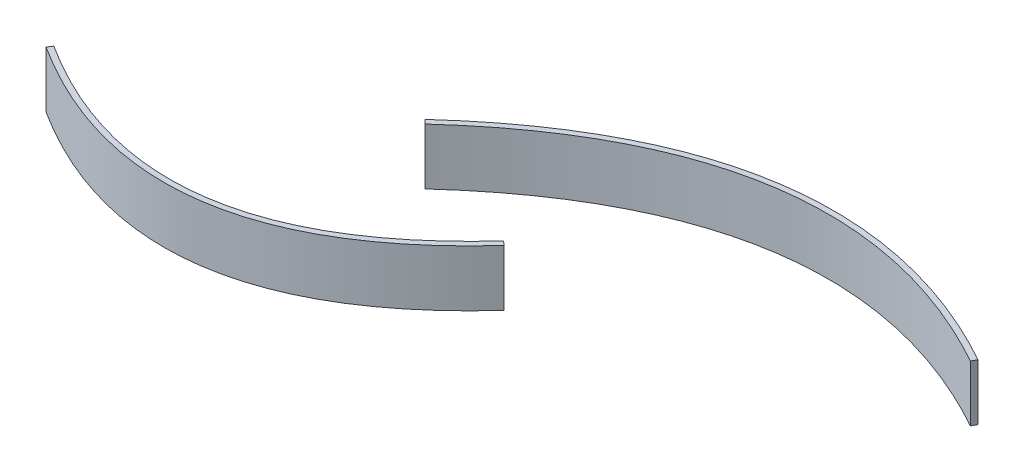
ISO-10303-21;
HEADER;
FILE_DESCRIPTION(('STEP AP214'),'2;1');
FILE_NAME('part.step','',(''),(''),'','','');
FILE_SCHEMA(('AUTOMOTIVE_DESIGN { 1 0 10303 214 1 1 1 1 }'));
ENDSEC;
DATA;
#1=APPLICATION_CONTEXT('core data for automotive mechanical design processes');
#2=APPLICATION_PROTOCOL_DEFINITION('international standard','automotive_design',2000,#1);
#3=PRODUCT_CONTEXT('',#1,'mechanical');
#4=PRODUCT('Part','Part','',(#3));
#5=PRODUCT_RELATED_PRODUCT_CATEGORY('part','',(#4));
#6=PRODUCT_DEFINITION_FORMATION('','',#4);
#7=PRODUCT_DEFINITION_CONTEXT('part definition',#1,'design');
#8=PRODUCT_DEFINITION('design','',#6,#7);
#9=PRODUCT_DEFINITION_SHAPE('','',#8);
#10=(LENGTH_UNIT() NAMED_UNIT(*) SI_UNIT(.MILLI.,.METRE.));
#11=(NAMED_UNIT(*) PLANE_ANGLE_UNIT() SI_UNIT($,.RADIAN.));
#12=(NAMED_UNIT(*) SI_UNIT($,.STERADIAN.) SOLID_ANGLE_UNIT());
#13=UNCERTAINTY_MEASURE_WITH_UNIT(LENGTH_MEASURE(1.E-05),#10,'distance_accuracy_value','');
#14=(GEOMETRIC_REPRESENTATION_CONTEXT(3) GLOBAL_UNCERTAINTY_ASSIGNED_CONTEXT((#13)) GLOBAL_UNIT_ASSIGNED_CONTEXT((#10,
#11,#12)) REPRESENTATION_CONTEXT('',''));
#15=CARTESIAN_POINT('',(0.,0.,0.));
#16=DIRECTION('',(0.,0.,1.));
#17=DIRECTION('',(1.,0.,0.));
#18=AXIS2_PLACEMENT_3D('',#15,#16,#17);
#19=CARTESIAN_POINT('',(374.628296099274,100.,-501.565262469826));
#20=DIRECTION('',(-0.843473753017367,0.,-0.537170390072645));
#21=DIRECTION('',(-0.537170390072645,0.,0.843473753017367));
#22=AXIS2_PLACEMENT_3D('',#19,#20,#21);
#23=PLANE('',#22);
#24=DIRECTION('',(0.537170390072645,0.,-0.843473753017367));
#25=VECTOR('',#24,1.);
#26=CARTESIAN_POINT('',(374.628296099274,0.,-501.565262469826));
#27=LINE('',#26,#25);
#28=CARTESIAN_POINT('',(374.628296099274,0.,-501.565262469826));
#29=VERTEX_POINT('',#28);
#30=CARTESIAN_POINT('',(380.,0.,-510.));
#31=VERTEX_POINT('',#30);
#32=EDGE_CURVE('E12',#29,#31,#27,.T.);
#33=ORIENTED_EDGE('',*,*,#32,.F.);
#34=DIRECTION('',(0.,-1.,0.));
#35=VECTOR('',#34,1.);
#36=CARTESIAN_POINT('',(374.628296099274,100.,-501.565262469826));
#37=LINE('',#36,#35);
#38=CARTESIAN_POINT('',(374.628296099274,100.,-501.565262469826));
#39=VERTEX_POINT('',#38);
#40=EDGE_CURVE('E89',#39,#29,#37,.T.);
#41=ORIENTED_EDGE('',*,*,#40,.F.);
#42=DIRECTION('',(0.537170390072645,0.,-0.843473753017367));
#43=VECTOR('',#42,1.);
#44=CARTESIAN_POINT('',(374.628296099274,100.,-501.565262469826));
#45=LINE('',#44,#43);
#46=CARTESIAN_POINT('',(380.,100.,-510.));
#47=VERTEX_POINT('',#46);
#48=EDGE_CURVE('E47',#39,#47,#45,.T.);
#49=ORIENTED_EDGE('',*,*,#48,.T.);
#50=DIRECTION('',(0.,-1.,0.));
#51=VECTOR('',#50,1.);
#52=CARTESIAN_POINT('',(380.,100.,-510.));
#53=LINE('',#52,#51);
#54=EDGE_CURVE('E62',#47,#31,#53,.T.);
#55=ORIENTED_EDGE('',*,*,#54,.T.);
#56=EDGE_LOOP('',(#33,#41,#49,#55));
#57=FACE_BOUND('',#56,.T.);
#58=ADVANCED_FACE('F43',(#57),#23,.T.);
#59=CARTESIAN_POINT('',(374.628296099274,100.,-501.565262469826));
#60=CARTESIAN_POINT('',(376.652675636594,100.,-500.276026448163));
#61=CARTESIAN_POINT('',(380.720758417512,100.,-497.707701121464));
#62=CARTESIAN_POINT('',(388.82405260283,100.,-492.681835618001));
#63=CARTESIAN_POINT('',(398.942317337423,100.,-486.574959139185));
#64=CARTESIAN_POINT('',(411.051084523365,100.,-479.537732392362));
#65=CARTESIAN_POINT('',(427.15772434303,100.,-470.539431246888));
#66=CARTESIAN_POINT('',(447.216750525808,100.,-460.014930368174));
#67=CARTESIAN_POINT('',(471.170377073836,100.,-448.544102413651));
#68=CARTESIAN_POINT('',(495.007185990314,100.,-438.233929118475));
#69=CARTESIAN_POINT('',(526.634300021727,100.,-426.037434744881));
#70=CARTESIAN_POINT('',(565.877106852233,100.,-413.704742254454));
#71=CARTESIAN_POINT('',(612.497099342666,100.,-403.587039941088));
#72=CARTESIAN_POINT('',(658.630861524168,100.,-398.171948107563));
#73=CARTESIAN_POINT('',(704.254057326222,100.,-397.476841105064));
#74=CARTESIAN_POINT('',(749.33471932846,100.,-401.511344410625));
#75=CARTESIAN_POINT('',(793.83769955949,100.,-410.274498162204));
#76=CARTESIAN_POINT('',(837.730363715614,100.,-423.754574123776));
#77=CARTESIAN_POINT('',(880.987503579431,100.,-441.931705095733));
#78=CARTESIAN_POINT('',(923.593867320603,100.,-464.782175640625));
#79=CARTESIAN_POINT('',(958.552261081277,100.,-487.699165006463));
#80=CARTESIAN_POINT('',(986.192007844851,100.,-508.347722137583));
#81=CARTESIAN_POINT('',(1006.75917592492,100.,-524.98957830755));
#82=CARTESIAN_POINT('',(1027.16474125962,100.,-542.785115939898));
#83=CARTESIAN_POINT('',(1044.03554306489,100.,-558.574716153539));
#84=CARTESIAN_POINT('',(1057.45285613472,100.,-571.782145534757));
#85=CARTESIAN_POINT('',(1067.4754843417,100.,-581.974522933829));
#86=CARTESIAN_POINT('',(1075.79709217904,100.,-590.71027783402));
#87=CARTESIAN_POINT('',(1082.42955700171,100.,-597.836888742615));
#88=CARTESIAN_POINT('',(1085.74867450723,100.,-601.458442056402));
#89=CARTESIAN_POINT('',(1087.39761253075,100.,-603.271305561629));
#90=B_SPLINE_CURVE_WITH_KNOTS('',3,(#59,#60,#61,#62,#63,#64,#65,#66,#67,#68,#69,#70,#71,#72,#73,
#74,#75,#76,#77,#78,#79,#80,#81,#82,#83,#84,#85,#86,#87,#88,#89),.UNSPECIFIED.,.F.,.F.,(4,1,1,1,
1,1,1,1,1,1,1,1,1,1,1,1,1,1,1,1,1,1,1,1,1,1,1,1,4),(0.,0.0078125,0.015625,0.03125,0.046875,
0.0625,0.09375,0.125,0.15625,0.1875,0.25,0.3125,0.375,0.4375,0.5,0.5625,0.625,0.6875,0.75,
0.8125,0.84375,0.875,0.90625,0.9375,0.953125,0.96875,0.984375,0.9921875,1.),.UNSPECIFIED.);
#91=DIRECTION('',(0.,-1.,0.));
#92=VECTOR('',#91,1.);
#93=SURFACE_OF_LINEAR_EXTRUSION('',#90,#92);
#94=CARTESIAN_POINT('',(374.628296099274,0.,-501.565262469826));
#95=CARTESIAN_POINT('',(376.652675636594,0.,-500.276026448163));
#96=CARTESIAN_POINT('',(380.720758417512,0.,-497.707701121464));
#97=CARTESIAN_POINT('',(388.82405260283,0.,-492.681835618001));
#98=CARTESIAN_POINT('',(398.942317337423,0.,-486.574959139185));
#99=CARTESIAN_POINT('',(411.051084523365,0.,-479.537732392362));
#100=CARTESIAN_POINT('',(427.15772434303,0.,-470.539431246888));
#101=CARTESIAN_POINT('',(447.216750525808,0.,-460.014930368174));
#102=CARTESIAN_POINT('',(471.170377073836,0.,-448.544102413651));
#103=CARTESIAN_POINT('',(495.007185990314,0.,-438.233929118475));
#104=CARTESIAN_POINT('',(526.634300021727,0.,-426.037434744881));
#105=CARTESIAN_POINT('',(565.877106852233,0.,-413.704742254454));
#106=CARTESIAN_POINT('',(612.497099342666,0.,-403.587039941088));
#107=CARTESIAN_POINT('',(658.630861524168,0.,-398.171948107563));
#108=CARTESIAN_POINT('',(704.254057326222,0.,-397.476841105064));
#109=CARTESIAN_POINT('',(749.33471932846,0.,-401.511344410625));
#110=CARTESIAN_POINT('',(793.83769955949,0.,-410.274498162204));
#111=CARTESIAN_POINT('',(837.730363715614,0.,-423.754574123776));
#112=CARTESIAN_POINT('',(880.987503579431,0.,-441.931705095733));
#113=CARTESIAN_POINT('',(923.593867320603,0.,-464.782175640625));
#114=CARTESIAN_POINT('',(958.552261081277,0.,-487.699165006463));
#115=CARTESIAN_POINT('',(986.192007844851,0.,-508.347722137583));
#116=CARTESIAN_POINT('',(1006.75917592492,0.,-524.98957830755));
#117=CARTESIAN_POINT('',(1027.16474125962,0.,-542.785115939898));
#118=CARTESIAN_POINT('',(1044.03554306489,0.,-558.574716153539));
#119=CARTESIAN_POINT('',(1057.45285613472,0.,-571.782145534757));
#120=CARTESIAN_POINT('',(1067.4754843417,0.,-581.974522933829));
#121=CARTESIAN_POINT('',(1075.79709217904,0.,-590.71027783402));
#122=CARTESIAN_POINT('',(1082.42955700171,0.,-597.836888742615));
#123=CARTESIAN_POINT('',(1085.74867450723,0.,-601.458442056402));
#124=CARTESIAN_POINT('',(1087.39761253075,0.,-603.271305561629));
#125=B_SPLINE_CURVE_WITH_KNOTS('',3,(#94,#95,#96,#97,#98,#99,#100,#101,#102,#103,#104,#105,#106,
#107,#108,#109,#110,#111,#112,#113,#114,#115,#116,#117,#118,#119,#120,#121,#122,#123,#124),
.UNSPECIFIED.,.F.,.F.,(4,1,1,1,1,1,1,1,1,1,1,1,1,1,1,1,1,1,1,1,1,1,1,1,1,1,1,1,4),(0.,0.0078125,
0.015625,0.03125,0.046875,0.0625,0.09375,0.125,0.15625,0.1875,0.25,0.3125,0.375,0.4375,0.5,
0.5625,0.625,0.6875,0.75,0.8125,0.84375,0.875,0.90625,0.9375,0.953125,0.96875,0.984375,
0.9921875,1.),.UNSPECIFIED.);
#126=CARTESIAN_POINT('',(1087.39761253075,0.,-603.271305561629));
#127=VERTEX_POINT('',#126);
#128=EDGE_CURVE('E92',#29,#127,#125,.T.);
#129=ORIENTED_EDGE('',*,*,#128,.T.);
#130=DIRECTION('',(0.,-1.,0.));
#131=VECTOR('',#130,1.);
#132=CARTESIAN_POINT('',(1087.39761253075,100.,-603.271305561629));
#133=LINE('',#132,#131);
#134=CARTESIAN_POINT('',(1087.39761253075,100.,-603.271305561629));
#135=VERTEX_POINT('',#134);
#136=EDGE_CURVE('E95',#135,#127,#133,.T.);
#137=ORIENTED_EDGE('',*,*,#136,.F.);
#138=EDGE_CURVE('E118',#39,#135,#90,.T.);
#139=ORIENTED_EDGE('',*,*,#138,.F.);
#140=ORIENTED_EDGE('',*,*,#40,.T.);
#141=EDGE_LOOP('',(#129,#137,#139,#140));
#142=FACE_BOUND('',#141,.T.);
#143=ADVANCED_FACE('F94',(#142),#93,.F.);
#144=CARTESIAN_POINT('',(1087.39761253075,100.,-603.271305561629));
#145=DIRECTION('',(-0.672869443837063,0.,0.739761253074532));
#146=DIRECTION('',(0.739761253074532,0.,0.672869443837063));
#147=AXIS2_PLACEMENT_3D('',#144,#145,#146);
#148=PLANE('',#147);
#149=DIRECTION('',(-0.739761253074532,0.,-0.672869443837063));
#150=VECTOR('',#149,1.);
#151=CARTESIAN_POINT('',(1087.39761253075,0.,-603.271305561629));
#152=LINE('',#151,#150);
#153=CARTESIAN_POINT('',(1080.,0.,-610.));
#154=VERTEX_POINT('',#153);
#155=EDGE_CURVE('E98',#127,#154,#152,.T.);
#156=ORIENTED_EDGE('',*,*,#155,.T.);
#157=DIRECTION('',(0.,-1.,0.));
#158=VECTOR('',#157,1.);
#159=CARTESIAN_POINT('',(1080.,100.,-610.));
#160=LINE('',#159,#158);
#161=CARTESIAN_POINT('',(1080.,100.,-610.));
#162=VERTEX_POINT('',#161);
#163=EDGE_CURVE('E104',#162,#154,#160,.T.);
#164=ORIENTED_EDGE('',*,*,#163,.F.);
#165=DIRECTION('',(-0.739761253074532,0.,-0.672869443837063));
#166=VECTOR('',#165,1.);
#167=CARTESIAN_POINT('',(1087.39761253075,100.,-603.271305561629));
#168=LINE('',#167,#166);
#169=EDGE_CURVE('E79',#135,#162,#168,.T.);
#170=ORIENTED_EDGE('',*,*,#169,.F.);
#171=ORIENTED_EDGE('',*,*,#136,.T.);
#172=EDGE_LOOP('',(#156,#164,#170,#171));
#173=FACE_BOUND('',#172,.T.);
#174=ADVANCED_FACE('F102',(#173),#148,.F.);
#175=CARTESIAN_POINT('',(380.,100.,-510.));
#176=CARTESIAN_POINT('',(765.648450941771,100.,-264.397895509813));
#177=CARTESIAN_POINT('',(1080.,100.,-610.));
#178=B_SPLINE_CURVE_WITH_KNOTS('',2,(#175,#176,#177),.UNSPECIFIED.,.F.,.F.,(3,3),(0.,1.),.UNSPECIFIED.);
#179=DIRECTION('',(0.,-1.,0.));
#180=VECTOR('',#179,1.);
#181=SURFACE_OF_LINEAR_EXTRUSION('',#178,#180);
#182=CARTESIAN_POINT('',(380.,0.,-510.));
#183=CARTESIAN_POINT('',(765.648450941771,0.,-264.397895509813));
#184=CARTESIAN_POINT('',(1080.,0.,-610.));
#185=B_SPLINE_CURVE_WITH_KNOTS('',2,(#182,#183,#184),.UNSPECIFIED.,.F.,.F.,(3,3),(0.,1.),.UNSPECIFIED.);
#186=EDGE_CURVE('E53',#31,#154,#185,.T.);
#187=ORIENTED_EDGE('',*,*,#186,.F.);
#188=ORIENTED_EDGE('',*,*,#54,.F.);
#189=EDGE_CURVE('E140',#47,#162,#178,.T.);
#190=ORIENTED_EDGE('',*,*,#189,.T.);
#191=ORIENTED_EDGE('',*,*,#163,.T.);
#192=EDGE_LOOP('',(#187,#188,#190,#191));
#193=FACE_BOUND('',#192,.T.);
#194=ADVANCED_FACE('F134',(#193),#181,.T.);
#195=CARTESIAN_POINT('',(747.824225470885,100.,-412.198947754906));
#196=DIRECTION('',(0.,-1.,0.));
#197=DIRECTION('',(0.,0.,-1.));
#198=AXIS2_PLACEMENT_3D('',#195,#196,#197);
#199=PLANE('',#198);
#200=ORIENTED_EDGE('',*,*,#48,.F.);
#201=ORIENTED_EDGE('',*,*,#138,.T.);
#202=ORIENTED_EDGE('',*,*,#169,.T.);
#203=ORIENTED_EDGE('',*,*,#189,.F.);
#204=EDGE_LOOP('',(#200,#201,#202,#203));
#205=FACE_BOUND('',#204,.T.);
#206=ADVANCED_FACE('F45',(#205),#199,.F.);
#207=CARTESIAN_POINT('',(747.824225470885,0.,-412.198947754906));
#208=DIRECTION('',(0.,-1.,0.));
#209=DIRECTION('',(0.,0.,-1.));
#210=AXIS2_PLACEMENT_3D('',#207,#208,#209);
#211=PLANE('',#210);
#212=ORIENTED_EDGE('',*,*,#32,.T.);
#213=ORIENTED_EDGE('',*,*,#186,.T.);
#214=ORIENTED_EDGE('',*,*,#155,.F.);
#215=ORIENTED_EDGE('',*,*,#128,.F.);
#216=EDGE_LOOP('',(#212,#213,#214,#215));
#217=FACE_BOUND('',#216,.T.);
#218=ADVANCED_FACE('F106',(#217),#211,.T.);
#219=CLOSED_SHELL('',(#58,#143,#174,#194,#206,#218));
#220=MANIFOLD_SOLID_BREP('B2',#219);
#221=CARTESIAN_POINT('',(830.,100.,-720.));
#222=DIRECTION('',(-0.73894708734198,0.,0.673763461541811));
#223=DIRECTION('',(0.673763461541811,0.,0.73894708734198));
#224=AXIS2_PLACEMENT_3D('',#221,#222,#223);
#225=PLANE('',#224);
#226=DIRECTION('',(-0.673763461541811,0.,-0.73894708734198));
#227=VECTOR('',#226,1.);
#228=CARTESIAN_POINT('',(830.,0.,-720.));
#229=LINE('',#228,#227);
#230=CARTESIAN_POINT('',(830.,0.,-720.));
#231=VERTEX_POINT('',#230);
#232=CARTESIAN_POINT('',(823.262365384582,0.,-727.38947087342));
#233=VERTEX_POINT('',#232);
#234=EDGE_CURVE('E272',#231,#233,#229,.T.);
#235=ORIENTED_EDGE('',*,*,#234,.F.);
#236=DIRECTION('',(0.,-1.,0.));
#237=VECTOR('',#236,1.);
#238=CARTESIAN_POINT('',(830.,100.,-720.));
#239=LINE('',#238,#237);
#240=CARTESIAN_POINT('',(830.,100.,-720.));
#241=VERTEX_POINT('',#240);
#242=EDGE_CURVE('E41',#241,#231,#239,.T.);
#243=ORIENTED_EDGE('',*,*,#242,.F.);
#244=DIRECTION('',(-0.673763461541811,0.,-0.73894708734198));
#245=VECTOR('',#244,1.);
#246=CARTESIAN_POINT('',(830.,100.,-720.));
#247=LINE('',#246,#245);
#248=CARTESIAN_POINT('',(823.262365384582,100.,-727.38947087342));
#249=VERTEX_POINT('',#248);
#250=EDGE_CURVE('E249',#241,#249,#247,.T.);
#251=ORIENTED_EDGE('',*,*,#250,.T.);
#252=DIRECTION('',(0.,-1.,0.));
#253=VECTOR('',#252,1.);
#254=CARTESIAN_POINT('',(823.262365384582,100.,-727.38947087342));
#255=LINE('',#254,#253);
#256=EDGE_CURVE('E192',#249,#233,#255,.T.);
#257=ORIENTED_EDGE('',*,*,#256,.T.);
#258=EDGE_LOOP('',(#235,#243,#251,#257));
#259=FACE_BOUND('',#258,.T.);
#260=ADVANCED_FACE('F189',(#259),#225,.T.);
#261=CARTESIAN_POINT('',(830.,100.,-720.));
#262=CARTESIAN_POINT('',(1233.96880920796,100.,-1088.33411743447));
#263=CARTESIAN_POINT('',(1680.,100.,-840.));
#264=B_SPLINE_CURVE_WITH_KNOTS('',2,(#261,#262,#263),.UNSPECIFIED.,.F.,.F.,(3,3),(0.,1.),.UNSPECIFIED.);
#265=DIRECTION('',(0.,-1.,0.));
#266=VECTOR('',#265,1.);
#267=SURFACE_OF_LINEAR_EXTRUSION('',#264,#266);
#268=CARTESIAN_POINT('',(830.,0.,-720.));
#269=CARTESIAN_POINT('',(1233.96880920796,0.,-1088.33411743447));
#270=CARTESIAN_POINT('',(1680.,0.,-840.));
#271=B_SPLINE_CURVE_WITH_KNOTS('',2,(#268,#269,#270),.UNSPECIFIED.,.F.,.F.,(3,3),(0.,1.),.UNSPECIFIED.);
#272=CARTESIAN_POINT('',(1680.,0.,-840.));
#273=VERTEX_POINT('',#272);
#274=EDGE_CURVE('E222',#231,#273,#271,.T.);
#275=ORIENTED_EDGE('',*,*,#274,.T.);
#276=DIRECTION('',(0.,-1.,0.));
#277=VECTOR('',#276,1.);
#278=CARTESIAN_POINT('',(1680.,100.,-840.));
#279=LINE('',#278,#277);
#280=CARTESIAN_POINT('',(1680.,100.,-840.));
#281=VERTEX_POINT('',#280);
#282=EDGE_CURVE('E198',#281,#273,#279,.T.);
#283=ORIENTED_EDGE('',*,*,#282,.F.);
#284=EDGE_CURVE('E239',#241,#281,#264,.T.);
#285=ORIENTED_EDGE('',*,*,#284,.F.);
#286=ORIENTED_EDGE('',*,*,#242,.T.);
#287=EDGE_LOOP('',(#275,#283,#285,#286));
#288=FACE_BOUND('',#287,.T.);
#289=ADVANCED_FACE('F263',(#288),#267,.F.);
#290=CARTESIAN_POINT('',(1680.,100.,-840.));
#291=DIRECTION('',(-0.873708668494165,0.,-0.486449547844536));
#292=DIRECTION('',(-0.486449547844536,0.,0.873708668494165));
#293=AXIS2_PLACEMENT_3D('',#290,#291,#292);
#294=PLANE('',#293);
#295=DIRECTION('',(0.486449547844536,0.,-0.873708668494165));
#296=VECTOR('',#295,1.);
#297=CARTESIAN_POINT('',(1680.,0.,-840.));
#298=LINE('',#297,#296);
#299=CARTESIAN_POINT('',(1684.86449547845,0.,-848.737086684942));
#300=VERTEX_POINT('',#299);
#301=EDGE_CURVE('E246',#273,#300,#298,.T.);
#302=ORIENTED_EDGE('',*,*,#301,.T.);
#303=DIRECTION('',(0.,-1.,0.));
#304=VECTOR('',#303,1.);
#305=CARTESIAN_POINT('',(1684.86449547845,100.,-848.737086684942));
#306=LINE('',#305,#304);
#307=CARTESIAN_POINT('',(1684.86449547845,100.,-848.737086684942));
#308=VERTEX_POINT('',#307);
#309=EDGE_CURVE('E243',#308,#300,#306,.T.);
#310=ORIENTED_EDGE('',*,*,#309,.F.);
#311=DIRECTION('',(0.486449547844536,0.,-0.873708668494165));
#312=VECTOR('',#311,1.);
#313=CARTESIAN_POINT('',(1680.,100.,-840.));
#314=LINE('',#313,#312);
#315=EDGE_CURVE('E234',#281,#308,#314,.T.);
#316=ORIENTED_EDGE('',*,*,#315,.F.);
#317=ORIENTED_EDGE('',*,*,#282,.T.);
#318=EDGE_LOOP('',(#302,#310,#316,#317));
#319=FACE_BOUND('',#318,.T.);
#320=ADVANCED_FACE('F244',(#319),#294,.F.);
#321=CARTESIAN_POINT('',(823.262365384582,100.,-727.38947087342));
#322=CARTESIAN_POINT('',(825.377734767907,100.,-729.318240365259));
#323=CARTESIAN_POINT('',(829.63006313926,100.,-733.168595845318));
#324=CARTESIAN_POINT('',(838.122239015633,100.,-740.75042349265));
#325=CARTESIAN_POINT('',(848.759608614526,100.,-750.046280332838));
#326=CARTESIAN_POINT('',(861.54571033407,100.,-760.897913290901));
#327=CARTESIAN_POINT('',(878.627388594764,100.,-774.966720202697));
#328=CARTESIAN_POINT('',(900.040277479275,100.,-791.800263599358));
#329=CARTESIAN_POINT('',(925.834434109176,100.,-810.796263839219));
#330=CARTESIAN_POINT('',(951.727686533768,100.,-828.586703777573));
#331=CARTESIAN_POINT('',(986.38483586032,100.,-850.698218527671));
#332=CARTESIAN_POINT('',(1029.95616366275,100.,-875.317057992119));
#333=CARTESIAN_POINT('',(1082.6416890622,100.,-900.013755811895));
#334=CARTESIAN_POINT('',(1135.72277447864,100.,-919.850002265138));
#335=CARTESIAN_POINT('',(1189.18983059094,100.,-934.811271326791));
#336=CARTESIAN_POINT('',(1243.02789866825,100.,-944.884927349803));
#337=CARTESIAN_POINT('',(1297.21758569495,100.,-950.062239620955));
#338=CARTESIAN_POINT('',(1351.73703230155,100.,-950.339907387656));
#339=CARTESIAN_POINT('',(1406.56450534525,100.,-945.720596555575));
#340=CARTESIAN_POINT('',(1461.68094302312,100.,-936.212298146059));
#341=CARTESIAN_POINT('',(1507.83991296771,100.,-924.224368531372));
#342=CARTESIAN_POINT('',(1544.89963168345,100.,-912.202195037405));
#343=CARTESIAN_POINT('',(1572.76005048154,100.,-901.971377888206));
#344=CARTESIAN_POINT('',(1600.68572667074,100.,-890.528013044506));
#345=CARTESIAN_POINT('',(1624.01121455606,100.,-879.982841333664));
#346=CARTESIAN_POINT('',(1642.70447578578,100.,-870.941814647309));
#347=CARTESIAN_POINT('',(1656.73992406332,100.,-863.859308903607));
#348=CARTESIAN_POINT('',(1668.45234787287,100.,-857.704094065342));
#349=CARTESIAN_POINT('',(1677.8246803068,100.,-852.632223036278));
#350=CARTESIAN_POINT('',(1682.5241629634,100.,-850.040099616827));
#351=CARTESIAN_POINT('',(1684.86449547845,100.,-848.737086684942));
#352=B_SPLINE_CURVE_WITH_KNOTS('',3,(#321,#322,#323,#324,#325,#326,#327,#328,#329,#330,#331,
#332,#333,#334,#335,#336,#337,#338,#339,#340,#341,#342,#343,#344,#345,#346,#347,#348,#349,#350,
#351),.UNSPECIFIED.,.F.,.F.,(4,1,1,1,1,1,1,1,1,1,1,1,1,1,1,1,1,1,1,1,1,1,1,1,1,1,1,1,4),(0.,
0.0078125,0.015625,0.03125,0.046875,0.0625,0.09375,0.125,0.15625,0.1875,0.25,0.3125,0.375,
0.4375,0.5,0.5625,0.625,0.6875,0.75,0.8125,0.84375,0.875,0.90625,0.9375,0.953125,0.96875,
0.984375,0.9921875,1.),.UNSPECIFIED.);
#353=DIRECTION('',(0.,-1.,0.));
#354=VECTOR('',#353,1.);
#355=SURFACE_OF_LINEAR_EXTRUSION('',#352,#354);
#356=CARTESIAN_POINT('',(823.262365384582,0.,-727.38947087342));
#357=CARTESIAN_POINT('',(825.377734767907,0.,-729.318240365259));
#358=CARTESIAN_POINT('',(829.63006313926,0.,-733.168595845318));
#359=CARTESIAN_POINT('',(838.122239015633,0.,-740.75042349265));
#360=CARTESIAN_POINT('',(848.759608614526,0.,-750.046280332838));
#361=CARTESIAN_POINT('',(861.54571033407,0.,-760.897913290901));
#362=CARTESIAN_POINT('',(878.627388594764,0.,-774.966720202697));
#363=CARTESIAN_POINT('',(900.040277479275,0.,-791.800263599358));
#364=CARTESIAN_POINT('',(925.834434109176,0.,-810.796263839219));
#365=CARTESIAN_POINT('',(951.727686533768,0.,-828.586703777573));
#366=CARTESIAN_POINT('',(986.38483586032,0.,-850.698218527671));
#367=CARTESIAN_POINT('',(1029.95616366275,0.,-875.317057992119));
#368=CARTESIAN_POINT('',(1082.6416890622,0.,-900.013755811895));
#369=CARTESIAN_POINT('',(1135.72277447864,0.,-919.850002265138));
#370=CARTESIAN_POINT('',(1189.18983059094,0.,-934.811271326791));
#371=CARTESIAN_POINT('',(1243.02789866825,0.,-944.884927349803));
#372=CARTESIAN_POINT('',(1297.21758569495,0.,-950.062239620955));
#373=CARTESIAN_POINT('',(1351.73703230155,0.,-950.339907387656));
#374=CARTESIAN_POINT('',(1406.56450534525,0.,-945.720596555575));
#375=CARTESIAN_POINT('',(1461.68094302312,0.,-936.212298146059));
#376=CARTESIAN_POINT('',(1507.83991296771,0.,-924.224368531372));
#377=CARTESIAN_POINT('',(1544.89963168345,0.,-912.202195037405));
#378=CARTESIAN_POINT('',(1572.76005048154,0.,-901.971377888206));
#379=CARTESIAN_POINT('',(1600.68572667074,0.,-890.528013044506));
#380=CARTESIAN_POINT('',(1624.01121455606,0.,-879.982841333664));
#381=CARTESIAN_POINT('',(1642.70447578578,0.,-870.941814647309));
#382=CARTESIAN_POINT('',(1656.73992406332,0.,-863.859308903607));
#383=CARTESIAN_POINT('',(1668.45234787287,0.,-857.704094065342));
#384=CARTESIAN_POINT('',(1677.8246803068,0.,-852.632223036278));
#385=CARTESIAN_POINT('',(1682.5241629634,0.,-850.040099616827));
#386=CARTESIAN_POINT('',(1684.86449547845,0.,-848.737086684942));
#387=B_SPLINE_CURVE_WITH_KNOTS('',3,(#356,#357,#358,#359,#360,#361,#362,#363,#364,#365,#366,
#367,#368,#369,#370,#371,#372,#373,#374,#375,#376,#377,#378,#379,#380,#381,#382,#383,#384,#385,
#386),.UNSPECIFIED.,.F.,.F.,(4,1,1,1,1,1,1,1,1,1,1,1,1,1,1,1,1,1,1,1,1,1,1,1,1,1,1,1,4),(0.,
0.0078125,0.015625,0.03125,0.046875,0.0625,0.09375,0.125,0.15625,0.1875,0.25,0.3125,0.375,
0.4375,0.5,0.5625,0.625,0.6875,0.75,0.8125,0.84375,0.875,0.90625,0.9375,0.953125,0.96875,
0.984375,0.9921875,1.),.UNSPECIFIED.);
#388=EDGE_CURVE('E278',#233,#300,#387,.T.);
#389=ORIENTED_EDGE('',*,*,#388,.F.);
#390=ORIENTED_EDGE('',*,*,#256,.F.);
#391=EDGE_CURVE('E238',#249,#308,#352,.T.);
#392=ORIENTED_EDGE('',*,*,#391,.T.);
#393=ORIENTED_EDGE('',*,*,#309,.T.);
#394=EDGE_LOOP('',(#389,#390,#392,#393));
#395=FACE_BOUND('',#394,.T.);
#396=ADVANCED_FACE('F248',(#395),#355,.T.);
#397=CARTESIAN_POINT('',(1243.08650182649,100.,-944.068870057826));
#398=DIRECTION('',(0.,1.,0.));
#399=DIRECTION('',(0.,0.,1.));
#400=AXIS2_PLACEMENT_3D('',#397,#398,#399);
#401=PLANE('',#400);
#402=ORIENTED_EDGE('',*,*,#250,.F.);
#403=ORIENTED_EDGE('',*,*,#284,.T.);
#404=ORIENTED_EDGE('',*,*,#315,.T.);
#405=ORIENTED_EDGE('',*,*,#391,.F.);
#406=EDGE_LOOP('',(#402,#403,#404,#405));
#407=FACE_BOUND('',#406,.T.);
#408=ADVANCED_FACE('F237',(#407),#401,.T.);
#409=CARTESIAN_POINT('',(1243.08650182649,0.,-944.068870057826));
#410=DIRECTION('',(0.,1.,0.));
#411=DIRECTION('',(0.,0.,1.));
#412=AXIS2_PLACEMENT_3D('',#409,#410,#411);
#413=PLANE('',#412);
#414=ORIENTED_EDGE('',*,*,#234,.T.);
#415=ORIENTED_EDGE('',*,*,#388,.T.);
#416=ORIENTED_EDGE('',*,*,#301,.F.);
#417=ORIENTED_EDGE('',*,*,#274,.F.);
#418=EDGE_LOOP('',(#414,#415,#416,#417));
#419=FACE_BOUND('',#418,.T.);
#420=ADVANCED_FACE('F266',(#419),#413,.F.);
#421=CLOSED_SHELL('',(#260,#289,#320,#396,#408,#420));
#422=MANIFOLD_SOLID_BREP('B6',#421);
#423=ADVANCED_BREP_SHAPE_REPRESENTATION('',(#18,#220,#422),#14);
#424=SHAPE_DEFINITION_REPRESENTATION(#9,#423);
ENDSEC;
END-ISO-10303-21;
